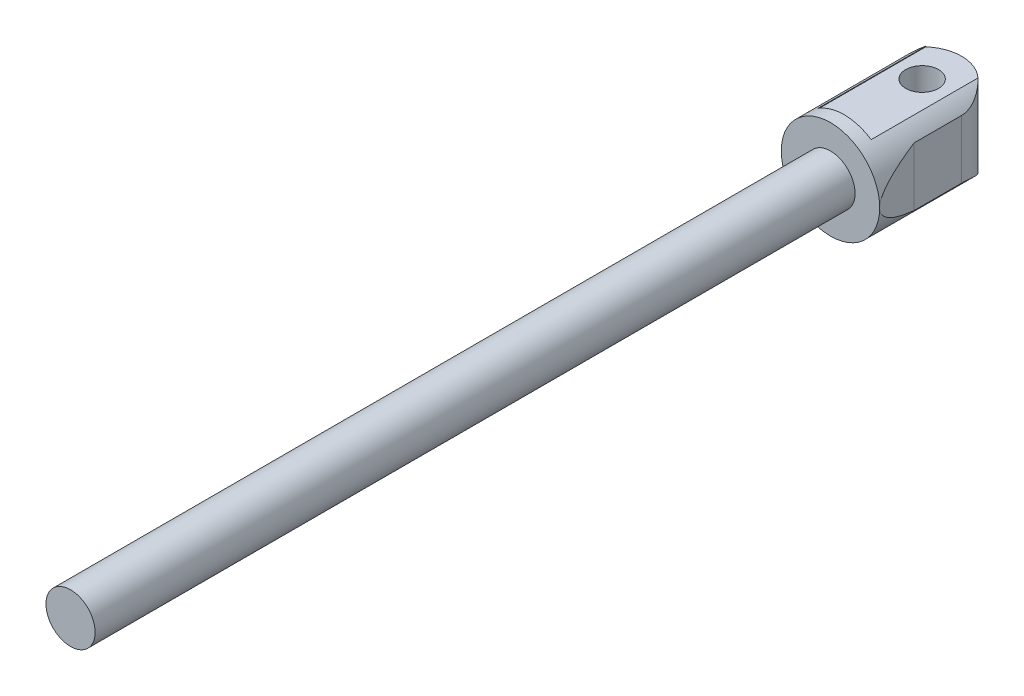
ISO-10303-21;
HEADER;
FILE_DESCRIPTION(('STEP AP214'),'2;1');
FILE_NAME('part.step','',(''),(''),'','','');
FILE_SCHEMA(('AUTOMOTIVE_DESIGN { 1 0 10303 214 1 1 1 1 }'));
ENDSEC;
DATA;
#1=APPLICATION_CONTEXT('core data for automotive mechanical design processes');
#2=APPLICATION_PROTOCOL_DEFINITION('international standard','automotive_design',2000,#1);
#3=PRODUCT_CONTEXT('',#1,'mechanical');
#4=PRODUCT('Part','Part','',(#3));
#5=PRODUCT_RELATED_PRODUCT_CATEGORY('part','',(#4));
#6=PRODUCT_DEFINITION_FORMATION('','',#4);
#7=PRODUCT_DEFINITION_CONTEXT('part definition',#1,'design');
#8=PRODUCT_DEFINITION('design','',#6,#7);
#9=PRODUCT_DEFINITION_SHAPE('','',#8);
#10=(LENGTH_UNIT() NAMED_UNIT(*) SI_UNIT(.MILLI.,.METRE.));
#11=(NAMED_UNIT(*) PLANE_ANGLE_UNIT() SI_UNIT($,.RADIAN.));
#12=(NAMED_UNIT(*) SI_UNIT($,.STERADIAN.) SOLID_ANGLE_UNIT());
#13=UNCERTAINTY_MEASURE_WITH_UNIT(LENGTH_MEASURE(1.E-05),#10,'distance_accuracy_value','');
#14=(GEOMETRIC_REPRESENTATION_CONTEXT(3) GLOBAL_UNCERTAINTY_ASSIGNED_CONTEXT((#13)) GLOBAL_UNIT_ASSIGNED_CONTEXT((#10,
#11,#12)) REPRESENTATION_CONTEXT('',''));
#15=CARTESIAN_POINT('',(0.,0.,0.));
#16=DIRECTION('',(0.,0.,1.));
#17=DIRECTION('',(1.,0.,0.));
#18=AXIS2_PLACEMENT_3D('',#15,#16,#17);
#19=CARTESIAN_POINT('',(0.,0.,-779.5));
#20=DIRECTION('',(0.,0.,1.));
#21=DIRECTION('',(1.,0.,0.));
#22=AXIS2_PLACEMENT_3D('',#19,#20,#21);
#23=CYLINDRICAL_SURFACE('',#22,75.);
#24=CARTESIAN_POINT('',(0.,0.,-600.36));
#25=DIRECTION('',(0.,0.,1.));
#26=DIRECTION('',(1.,0.,0.));
#27=AXIS2_PLACEMENT_3D('',#24,#25,#26);
#28=CIRCLE('',#27,75.);
#29=CARTESIAN_POINT('',(-39.76,-63.5935720022079,-600.36));
#30=VERTEX_POINT('',#29);
#31=CARTESIAN_POINT('',(41.2003774254557,-62.67,-600.36));
#32=VERTEX_POINT('',#31);
#33=EDGE_CURVE('E11',#30,#32,#28,.T.);
#34=ORIENTED_EDGE('',*,*,#33,.T.);
#35=DIRECTION('',(0.,0.,1.));
#36=VECTOR('',#35,1.);
#37=CARTESIAN_POINT('',(41.2003774254557,-62.67,-779.5));
#38=LINE('',#37,#36);
#39=CARTESIAN_POINT('',(41.2003774254557,-62.67,-763.207542593415));
#40=VERTEX_POINT('',#39);
#41=EDGE_CURVE('E164',#32,#40,#38,.F.);
#42=ORIENTED_EDGE('',*,*,#41,.T.);
#43=CARTESIAN_POINT('',(-60.24,-44.6782094538266,-719.26));
#44=CARTESIAN_POINT('',(-60.2400178079099,-44.6781600574085,-719.828290465722));
#45=CARTESIAN_POINT('',(-60.2319587873705,-44.6890508755152,-720.39656218921));
#46=CARTESIAN_POINT('',(-60.1998215340953,-44.7323463897226,-721.531764195724));
#47=CARTESIAN_POINT('',(-60.1757452688689,-44.7647484434477,-722.098694634928));
#48=CARTESIAN_POINT('',(-60.1117618498983,-44.8506276460675,-723.229097348567));
#49=CARTESIAN_POINT('',(-60.0718814338146,-44.9040691990779,-723.792573839809));
#50=CARTESIAN_POINT('',(-59.9765508624123,-45.0313181814211,-724.915865845747));
#51=CARTESIAN_POINT('',(-59.9211003342414,-45.1051260984596,-725.475681272444));
#52=CARTESIAN_POINT('',(-59.7335468937856,-45.3535736231613,-727.133059782846));
#53=CARTESIAN_POINT('',(-59.579345714394,-45.5564629679155,-728.224071832143));
#54=CARTESIAN_POINT('',(-59.2145267124963,-46.0296488247377,-730.381900273667));
#55=CARTESIAN_POINT('',(-59.0038806906372,-46.2999790250019,-731.448704282016));
#56=CARTESIAN_POINT('',(-58.4440093757804,-47.0060329056827,-733.933433028063));
#57=CARTESIAN_POINT('',(-58.0722004683523,-47.4662518580863,-735.339338651747));
#58=CARTESIAN_POINT('',(-57.2382713941835,-48.4685962338971,-738.093774649917));
#59=CARTESIAN_POINT('',(-56.7761192768603,-49.0107506189746,-739.442284519888));
#60=CARTESIAN_POINT('',(-55.7643630895057,-50.1590021187968,-742.090159337451));
#61=CARTESIAN_POINT('',(-55.2141670641873,-50.7655219627618,-743.389112144909));
#62=CARTESIAN_POINT('',(-54.0333462567749,-52.0205706439733,-745.928636163568));
#63=CARTESIAN_POINT('',(-53.4027216703069,-52.6690993790398,-747.16920751676));
#64=CARTESIAN_POINT('',(-52.2762635543612,-53.7829569582085,-749.209025319231));
#65=CARTESIAN_POINT('',(-51.8009972366958,-54.2412545453589,-750.023605457012));
#66=CARTESIAN_POINT('',(-50.8149920012892,-55.166052124261,-751.626333183248));
#67=CARTESIAN_POINT('',(-50.3042507351771,-55.6325526575019,-752.414479016673));
#68=CARTESIAN_POINT('',(-49.2476512471584,-56.5700266881361,-753.964560261676));
#69=CARTESIAN_POINT('',(-48.7017817012025,-57.0410015857711,-754.726487098517));
#70=CARTESIAN_POINT('',(-47.575401564295,-57.9837956644955,-756.223716425041));
#71=CARTESIAN_POINT('',(-46.9948917675563,-58.4556148259876,-756.959019524519));
#72=CARTESIAN_POINT('',(-45.8005633203702,-59.3960016966706,-758.401294882978));
#73=CARTESIAN_POINT('',(-45.1868095734377,-59.8645738605939,-759.108317971517));
#74=CARTESIAN_POINT('',(-43.9251392828326,-60.7963583877545,-760.49491686182));
#75=CARTESIAN_POINT('',(-43.2772221648622,-61.2595706607306,-761.174492201837));
#76=CARTESIAN_POINT('',(-41.9475850550493,-62.1775883903148,-762.505138108048));
#77=CARTESIAN_POINT('',(-41.2658769162934,-62.6323967190465,-763.156218520785));
#78=CARTESIAN_POINT('',(-39.8686242864576,-63.5309605389146,-764.42905593896));
#79=CARTESIAN_POINT('',(-39.1530782386654,-63.9747155201054,-765.050811592679));
#80=CARTESIAN_POINT('',(-37.2468461051281,-65.1117483231765,-766.629320906306));
#81=CARTESIAN_POINT('',(-36.0296742533632,-65.7942495191978,-767.562168566609));
#82=CARTESIAN_POINT('',(-33.5105744588536,-67.1123109247441,-769.342709382505));
#83=CARTESIAN_POINT('',(-32.2086502504295,-67.7478731998406,-770.190406285794));
#84=CARTESIAN_POINT('',(-29.5242213010121,-68.9600364948678,-771.792065043538));
#85=CARTESIAN_POINT('',(-28.1418050675466,-69.5367004253844,-772.5461271012));
#86=CARTESIAN_POINT('',(-25.2999860534751,-70.6202650176077,-773.952599332274));
#87=CARTESIAN_POINT('',(-23.8405962195933,-71.1271773598839,-774.605026527838));
#88=CARTESIAN_POINT('',(-21.0954994923436,-71.9840102433112,-775.701583497893));
#89=CARTESIAN_POINT('',(-19.8201988986271,-72.3460538606143,-776.162332232936));
#90=CARTESIAN_POINT('',(-17.2265455791747,-73.0070978896685,-777.000457002701));
#91=CARTESIAN_POINT('',(-15.9081972883068,-73.3061047720846,-777.377841594868));
#92=CARTESIAN_POINT('',(-13.2362654567833,-73.8353247837602,-778.043957757132));
#93=CARTESIAN_POINT('',(-11.8826965347954,-74.0655659749473,-778.332725491354));
#94=CARTESIAN_POINT('',(-9.14860208476662,-74.4527308048549,-778.817434579232));
#95=CARTESIAN_POINT('',(-7.76807623605475,-74.6096535708486,-779.013374827941));
#96=CARTESIAN_POINT('',(-4.98519133448533,-74.8472104068613,-779.309732770816));
#97=CARTESIAN_POINT('',(-3.58277168330377,-74.9275685164805,-779.409804936656));
#98=CARTESIAN_POINT('',(-0.772047765146182,-75.009203316087,-779.511465603033));
#99=CARTESIAN_POINT('',(0.636256513318128,-75.010479851615,-779.513053911214));
#100=CARTESIAN_POINT('',(3.44738130554763,-74.9339228526574,-779.417719287318));
#101=CARTESIAN_POINT('',(4.85020167031448,-74.8560871834791,-779.320793697029));
#102=CARTESIAN_POINT('',(7.63920987736585,-74.6230571785201,-779.030107990285));
#103=CARTESIAN_POINT('',(9.02539811882413,-74.4678647031341,-778.836350202599));
#104=CARTESIAN_POINT('',(11.6942336026653,-74.0942528678015,-778.368666765328));
#105=CARTESIAN_POINT('',(12.9783419864204,-73.8798453406996,-778.099818481114));
#106=CARTESIAN_POINT('',(15.5150169190735,-73.389053270928,-777.482382498886));
#107=CARTESIAN_POINT('',(16.7675849086185,-73.1126715647391,-777.133798450266));
#108=CARTESIAN_POINT('',(19.2350118305412,-72.5026196247788,-776.361170252726));
#109=CARTESIAN_POINT('',(20.4498655744626,-72.1689415494617,-775.937115774681));
#110=CARTESIAN_POINT('',(22.8366069616576,-71.4495854427753,-775.018250971808));
#111=CARTESIAN_POINT('',(24.0084920516861,-71.0639043276761,-774.523436450872));
#112=CARTESIAN_POINT('',(26.4148763715552,-70.2071026582862,-773.417442933846));
#113=CARTESIAN_POINT('',(27.6446885155894,-69.7313416984657,-772.799666840782));
#114=CARTESIAN_POINT('',(30.044205201299,-68.7316192035965,-771.490943168662));
#115=CARTESIAN_POINT('',(31.2139065790632,-68.2076551354341,-770.799991743892));
#116=CARTESIAN_POINT('',(33.4910847100174,-67.1188541024937,-769.350193254196));
#117=CARTESIAN_POINT('',(34.598538696432,-66.5540023537789,-768.591321607373));
#118=CARTESIAN_POINT('',(36.7492028355753,-65.3910611321772,-767.01075798669));
#119=CARTESIAN_POINT('',(37.7924098854835,-64.7929700566392,-766.189062983052));
#120=CARTESIAN_POINT('',(40.0223723413489,-63.4447737423033,-764.311177013693));
#121=CARTESIAN_POINT('',(41.1943084911169,-62.6887740221905,-763.241593271249));
#122=CARTESIAN_POINT('',(43.4425647326047,-61.1522518580056,-761.022386640751));
#123=CARTESIAN_POINT('',(44.5188691548117,-60.3717254234238,-759.872750690773));
#124=CARTESIAN_POINT('',(46.5763273607766,-58.7990141624916,-757.495810334168));
#125=CARTESIAN_POINT('',(47.557366549967,-58.0068165838935,-756.268415251896));
#126=CARTESIAN_POINT('',(49.421798651803,-56.426751555674,-753.739149518499));
#127=CARTESIAN_POINT('',(50.3052028454613,-55.6388836158117,-752.43728749792));
#128=CARTESIAN_POINT('',(51.89964924515,-54.1526375740352,-749.876267517932));
#129=CARTESIAN_POINT('',(52.6190088208818,-53.4524592129906,-748.623332632824));
#130=CARTESIAN_POINT('',(53.9725150401032,-52.0854346493448,-746.054279861048));
#131=CARTESIAN_POINT('',(54.6066504433973,-51.4185928507644,-744.738153671103));
#132=CARTESIAN_POINT('',(55.7846304354103,-50.1381159757584,-742.043585935046));
#133=CARTESIAN_POINT('',(56.3286040840631,-49.5244054579738,-740.665237118297));
#134=CARTESIAN_POINT('',(57.3211394120789,-48.3721511900354,-737.844339090309));
#135=CARTESIAN_POINT('',(57.7697490469584,-47.8335697069594,-736.401822590383));
#136=CARTESIAN_POINT('',(58.4457191064089,-47.0031279088765,-733.892388728201));
#137=CARTESIAN_POINT('',(58.6992315679535,-46.6854790108299,-732.841028847432));
#138=CARTESIAN_POINT('',(59.1518217809699,-46.1106913011534,-730.710144208112));
#139=CARTESIAN_POINT('',(59.3508975267681,-45.8535547190958,-729.630618413417));
#140=CARTESIAN_POINT('',(59.6906365014732,-45.4104204996476,-727.451267133762));
#141=CARTESIAN_POINT('',(59.8314814126076,-45.2242017418218,-726.351516142372));
#142=CARTESIAN_POINT('',(59.9973427584587,-45.003632668456,-724.690155341706));
#143=CARTESIAN_POINT('',(60.0450574966451,-44.9399092841435,-724.134518285798));
#144=CARTESIAN_POINT('',(60.1251211694355,-44.8327377713292,-723.020211554776));
#145=CARTESIAN_POINT('',(60.1574721518942,-44.7892869406862,-722.461542293874));
#146=CARTESIAN_POINT('',(60.2013344133764,-44.7303073056669,-721.462392425623));
#147=CARTESIAN_POINT('',(60.215827661604,-44.7107879707551,-721.022270619038));
#148=CARTESIAN_POINT('',(60.2351632145741,-44.6847309155557,-720.141438317674));
#149=CARTESIAN_POINT('',(60.2400056620304,-44.6781930033018,-719.700727831697));
#150=CARTESIAN_POINT('',(60.24,-44.6782094538266,-719.26));
#151=B_SPLINE_CURVE_WITH_KNOTS('',3,(#43,#44,#45,#46,#47,#48,#49,#50,#51,#52,#53,#54,#55,#56,
#57,#58,#59,#60,#61,#62,#63,#64,#65,#66,#67,#68,#69,#70,#71,#72,#73,#74,#75,#76,#77,#78,#79,#80,
#81,#82,#83,#84,#85,#86,#87,#88,#89,#90,#91,#92,#93,#94,#95,#96,#97,#98,#99,#100,#101,#102,#103,
#104,#105,#106,#107,#108,#109,#110,#111,#112,#113,#114,#115,#116,#117,#118,#119,#120,#121,#122,
#123,#124,#125,#126,#127,#128,#129,#130,#131,#132,#133,#134,#135,#136,#137,#138,#139,#140,#141,
#142,#143,#144,#145,#146,#147,#148,#149,#150),.UNSPECIFIED.,.F.,.F.,(4,2,2,2,2,2,2,2,2,2,2,2,2,
2,2,2,2,2,2,2,2,2,2,2,2,2,2,2,2,2,2,2,2,2,2,2,2,2,2,2,2,2,2,2,2,2,2,2,2,2,2,2,2,4),(0.,
1.70467825600655,3.40914715318528,5.1107446356174,6.81238286911238,10.1690547530893,
13.5274067378926,18.0960912168657,22.6663943795239,27.2688272269156,31.8712488800422,
35.0160037136267,38.1609669224912,41.3069490787516,44.4528591333346,47.5928343934739,
50.7328624544908,53.8717967571155,57.0108756070996,62.0415609635563,67.0720248100224,
72.0970580485064,77.1212487704394,81.3274604550505,85.5332401653048,89.7373012270587,
93.9414123294897,98.1606195330323,102.379834977388,106.599164272287,110.818392099197,
114.802157722078,118.785741050177,122.769870004199,126.754235317196,131.118584336059,
135.483162836274,139.849327415778,144.215702695104,149.483389309644,154.751937463041,
160.026746623712,165.30094568003,170.113871800534,174.927432075062,179.734041445779,
184.538227978227,187.916895025078,191.295686539215,194.663855068665,196.347306267145,
198.030533013225,199.352627904336,200.674703244482),.UNSPECIFIED.);
#152=CARTESIAN_POINT('',(60.24,-44.6782094538266,-719.26));
#153=VERTEX_POINT('',#152);
#154=EDGE_CURVE('E214',#40,#153,#151,.T.);
#155=ORIENTED_EDGE('',*,*,#154,.T.);
#156=DIRECTION('',(0.,0.,1.));
#157=VECTOR('',#156,1.);
#158=CARTESIAN_POINT('',(60.24,-44.6782094538266,-779.5));
#159=LINE('',#158,#157);
#160=CARTESIAN_POINT('',(60.24,-44.6782094538266,-646.55));
#161=VERTEX_POINT('',#160);
#162=EDGE_CURVE('E300',#153,#161,#159,.T.);
#163=ORIENTED_EDGE('',*,*,#162,.T.);
#164=CARTESIAN_POINT('',(0.,0.,-920.201219512196));
#165=DIRECTION('',(-0.976616950407174,0.,0.214986818613122));
#166=DIRECTION('',(0.214986818613122,0.,0.976616950407174));
#167=AXIS2_PLACEMENT_3D('',#164,#165,#166);
#168=ELLIPSE('',#167,348.85859739599,75.);
#169=CARTESIAN_POINT('',(75.,0.,-579.5));
#170=VERTEX_POINT('',#169);
#171=EDGE_CURVE('E183',#161,#170,#168,.T.);
#172=ORIENTED_EDGE('',*,*,#171,.T.);
#173=CARTESIAN_POINT('',(0.,0.,-579.5));
#174=DIRECTION('',(0.,0.,-1.));
#175=DIRECTION('',(-1.,0.,0.));
#176=AXIS2_PLACEMENT_3D('',#173,#174,#175);
#177=CIRCLE('',#176,75.);
#178=CARTESIAN_POINT('',(-75.,0.,-579.5));
#179=VERTEX_POINT('',#178);
#180=EDGE_CURVE('E270',#170,#179,#177,.T.);
#181=ORIENTED_EDGE('',*,*,#180,.T.);
#182=CARTESIAN_POINT('',(0.,0.,-920.201219512196));
#183=DIRECTION('',(0.976616950407174,0.,0.214986818613122));
#184=DIRECTION('',(-0.214986818613122,0.,0.976616950407174));
#185=AXIS2_PLACEMENT_3D('',#182,#183,#184);
#186=ELLIPSE('',#185,348.85859739599,75.);
#187=CARTESIAN_POINT('',(-60.24,-44.6782094538266,-646.55));
#188=VERTEX_POINT('',#187);
#189=EDGE_CURVE('E203',#179,#188,#186,.T.);
#190=ORIENTED_EDGE('',*,*,#189,.T.);
#191=DIRECTION('',(0.,0.,1.));
#192=VECTOR('',#191,1.);
#193=CARTESIAN_POINT('',(-60.24,-44.6782094538266,-779.5));
#194=LINE('',#193,#192);
#195=CARTESIAN_POINT('',(-60.24,-44.6782094538266,-719.26));
#196=VERTEX_POINT('',#195);
#197=EDGE_CURVE('E297',#188,#196,#194,.F.);
#198=ORIENTED_EDGE('',*,*,#197,.T.);
#199=CARTESIAN_POINT('',(-39.76,-63.5935720022079,-764.514833995939));
#200=VERTEX_POINT('',#199);
#201=EDGE_CURVE('E216',#196,#200,#151,.T.);
#202=ORIENTED_EDGE('',*,*,#201,.T.);
#203=DIRECTION('',(0.,0.,1.));
#204=VECTOR('',#203,1.);
#205=CARTESIAN_POINT('',(-39.76,-63.5935720022079,-779.5));
#206=LINE('',#205,#204);
#207=EDGE_CURVE('E67',#30,#200,#206,.F.);
#208=ORIENTED_EDGE('',*,*,#207,.F.);
#209=EDGE_LOOP('',(#34,#42,#155,#163,#172,#181,#190,#198,#202,#208));
#210=FACE_BOUND('',#209,.T.);
#211=ADVANCED_FACE('F43',(#210),#23,.T.);
#212=CARTESIAN_POINT('',(0.,0.,579.5));
#213=DIRECTION('',(0.,0.,-1.));
#214=DIRECTION('',(-1.,0.,0.));
#215=AXIS2_PLACEMENT_3D('',#212,#213,#214);
#216=CYLINDRICAL_SURFACE('',#215,37.5);
#217=CARTESIAN_POINT('',(0.,0.,579.5));
#218=DIRECTION('',(0.,0.,1.));
#219=DIRECTION('',(1.,0.,0.));
#220=AXIS2_PLACEMENT_3D('',#217,#218,#219);
#221=CIRCLE('',#220,37.5);
#222=CARTESIAN_POINT('',(37.5,0.,579.5));
#223=VERTEX_POINT('',#222);
#224=EDGE_CURVE('E282',#223,#223,#221,.T.);
#225=ORIENTED_EDGE('',*,*,#224,.F.);
#226=EDGE_LOOP('',(#225));
#227=FACE_BOUND('',#226,.T.);
#228=CARTESIAN_POINT('',(0.,0.,-579.5));
#229=DIRECTION('',(0.,0.,1.));
#230=DIRECTION('',(1.,0.,0.));
#231=AXIS2_PLACEMENT_3D('',#228,#229,#230);
#232=CIRCLE('',#231,37.5);
#233=CARTESIAN_POINT('',(37.5,0.,-579.5));
#234=VERTEX_POINT('',#233);
#235=EDGE_CURVE('E280',#234,#234,#232,.T.);
#236=ORIENTED_EDGE('',*,*,#235,.T.);
#237=EDGE_LOOP('',(#236));
#238=FACE_BOUND('',#237,.T.);
#239=ADVANCED_FACE('F45',(#227,#238),#216,.T.);
#240=CARTESIAN_POINT('',(0.,0.,579.5));
#241=DIRECTION('',(0.,0.,1.));
#242=DIRECTION('',(1.,0.,0.));
#243=AXIS2_PLACEMENT_3D('',#240,#241,#242);
#244=PLANE('',#243);
#245=ORIENTED_EDGE('',*,*,#224,.T.);
#246=EDGE_LOOP('',(#245));
#247=FACE_BOUND('',#246,.T.);
#248=ADVANCED_FACE('F244',(#247),#244,.T.);
#249=CARTESIAN_POINT('',(60.24,44.6782094538266,-719.26));
#250=CARTESIAN_POINT('',(60.2400178079099,44.6781600574085,-719.828290465722));
#251=CARTESIAN_POINT('',(60.2319587873705,44.6890508755152,-720.39656218921));
#252=CARTESIAN_POINT('',(60.1998215340953,44.7323463897226,-721.531764195724));
#253=CARTESIAN_POINT('',(60.1757452688689,44.7647484434477,-722.098694634928));
#254=CARTESIAN_POINT('',(60.1117618498983,44.8506276460675,-723.229097348567));
#255=CARTESIAN_POINT('',(60.0718814338146,44.9040691990779,-723.792573839809));
#256=CARTESIAN_POINT('',(59.9765508624123,45.0313181814211,-724.915865845747));
#257=CARTESIAN_POINT('',(59.9211003342414,45.1051260984596,-725.475681272444));
#258=CARTESIAN_POINT('',(59.7335468937856,45.3535736231613,-727.133059782846));
#259=CARTESIAN_POINT('',(59.579345714394,45.5564629679155,-728.224071832143));
#260=CARTESIAN_POINT('',(59.2145267124963,46.0296488247377,-730.381900273667));
#261=CARTESIAN_POINT('',(59.0038806906372,46.2999790250019,-731.448704282016));
#262=CARTESIAN_POINT('',(58.4440093757804,47.0060329056827,-733.933433028063));
#263=CARTESIAN_POINT('',(58.0722004683523,47.4662518580863,-735.339338651747));
#264=CARTESIAN_POINT('',(57.2382713941835,48.4685962338971,-738.093774649917));
#265=CARTESIAN_POINT('',(56.7761192768603,49.0107506189746,-739.442284519888));
#266=CARTESIAN_POINT('',(55.7643630895057,50.1590021187968,-742.090159337451));
#267=CARTESIAN_POINT('',(55.2141670641873,50.7655219627618,-743.389112144909));
#268=CARTESIAN_POINT('',(54.0333462567749,52.0205706439733,-745.928636163568));
#269=CARTESIAN_POINT('',(53.4027216703069,52.6690993790398,-747.16920751676));
#270=CARTESIAN_POINT('',(52.2762635543612,53.7829569582085,-749.209025319231));
#271=CARTESIAN_POINT('',(51.8009972366958,54.2412545453589,-750.023605457012));
#272=CARTESIAN_POINT('',(50.8149920012892,55.166052124261,-751.626333183248));
#273=CARTESIAN_POINT('',(50.3042507351771,55.6325526575019,-752.414479016673));
#274=CARTESIAN_POINT('',(49.2476512471584,56.5700266881361,-753.964560261676));
#275=CARTESIAN_POINT('',(48.7017817012025,57.0410015857711,-754.726487098517));
#276=CARTESIAN_POINT('',(47.575401564295,57.9837956644955,-756.223716425041));
#277=CARTESIAN_POINT('',(46.9948917675563,58.4556148259876,-756.959019524519));
#278=CARTESIAN_POINT('',(45.8005633203702,59.3960016966706,-758.401294882978));
#279=CARTESIAN_POINT('',(45.1868095734377,59.8645738605939,-759.108317971517));
#280=CARTESIAN_POINT('',(43.9251392828326,60.7963583877545,-760.49491686182));
#281=CARTESIAN_POINT('',(43.2772221648622,61.2595706607306,-761.174492201837));
#282=CARTESIAN_POINT('',(41.9475850550493,62.1775883903148,-762.505138108048));
#283=CARTESIAN_POINT('',(41.2658769162934,62.6323967190465,-763.156218520785));
#284=CARTESIAN_POINT('',(39.8686242864576,63.5309605389146,-764.42905593896));
#285=CARTESIAN_POINT('',(39.1530782386654,63.9747155201054,-765.050811592679));
#286=CARTESIAN_POINT('',(37.2468461051281,65.1117483231765,-766.629320906306));
#287=CARTESIAN_POINT('',(36.0296742533632,65.7942495191978,-767.562168566609));
#288=CARTESIAN_POINT('',(33.5105744588536,67.1123109247441,-769.342709382505));
#289=CARTESIAN_POINT('',(32.2086502504295,67.7478731998406,-770.190406285794));
#290=CARTESIAN_POINT('',(29.5242213010121,68.9600364948678,-771.792065043538));
#291=CARTESIAN_POINT('',(28.1418050675466,69.5367004253844,-772.5461271012));
#292=CARTESIAN_POINT('',(25.2999860534751,70.6202650176077,-773.952599332274));
#293=CARTESIAN_POINT('',(23.8405962195933,71.1271773598839,-774.605026527838));
#294=CARTESIAN_POINT('',(21.0954994923436,71.9840102433112,-775.701583497893));
#295=CARTESIAN_POINT('',(19.8201988986271,72.3460538606143,-776.162332232936));
#296=CARTESIAN_POINT('',(17.2265455791747,73.0070978896685,-777.000457002701));
#297=CARTESIAN_POINT('',(15.9081972883068,73.3061047720846,-777.377841594868));
#298=CARTESIAN_POINT('',(13.2362654567833,73.8353247837602,-778.043957757132));
#299=CARTESIAN_POINT('',(11.8826965347954,74.0655659749473,-778.332725491354));
#300=CARTESIAN_POINT('',(9.14860208476662,74.4527308048549,-778.817434579232));
#301=CARTESIAN_POINT('',(7.76807623605475,74.6096535708486,-779.013374827941));
#302=CARTESIAN_POINT('',(4.98519133448533,74.8472104068613,-779.309732770816));
#303=CARTESIAN_POINT('',(3.58277168330377,74.9275685164805,-779.409804936656));
#304=CARTESIAN_POINT('',(0.772047765146182,75.009203316087,-779.511465603033));
#305=CARTESIAN_POINT('',(-0.636256513318128,75.010479851615,-779.513053911214));
#306=CARTESIAN_POINT('',(-3.44738130554763,74.9339228526574,-779.417719287318));
#307=CARTESIAN_POINT('',(-4.85020167031448,74.8560871834791,-779.320793697029));
#308=CARTESIAN_POINT('',(-7.63920987736585,74.6230571785201,-779.030107990285));
#309=CARTESIAN_POINT('',(-9.02539811882413,74.4678647031341,-778.836350202599));
#310=CARTESIAN_POINT('',(-11.6942336026653,74.0942528678015,-778.368666765328));
#311=CARTESIAN_POINT('',(-12.9783419864204,73.8798453406996,-778.099818481114));
#312=CARTESIAN_POINT('',(-15.5150169190735,73.389053270928,-777.482382498886));
#313=CARTESIAN_POINT('',(-16.7675849086185,73.1126715647391,-777.133798450266));
#314=CARTESIAN_POINT('',(-19.2350118305412,72.5026196247788,-776.361170252726));
#315=CARTESIAN_POINT('',(-20.4498655744626,72.1689415494617,-775.937115774681));
#316=CARTESIAN_POINT('',(-22.8366069616576,71.4495854427753,-775.018250971808));
#317=CARTESIAN_POINT('',(-24.0084920516861,71.0639043276761,-774.523436450872));
#318=CARTESIAN_POINT('',(-26.4148763715552,70.2071026582862,-773.417442933846));
#319=CARTESIAN_POINT('',(-27.6446885155894,69.7313416984657,-772.799666840782));
#320=CARTESIAN_POINT('',(-30.044205201299,68.7316192035965,-771.490943168662));
#321=CARTESIAN_POINT('',(-31.2139065790632,68.2076551354341,-770.799991743892));
#322=CARTESIAN_POINT('',(-33.4910847100174,67.1188541024937,-769.350193254196));
#323=CARTESIAN_POINT('',(-34.598538696432,66.5540023537789,-768.591321607373));
#324=CARTESIAN_POINT('',(-36.7492028355753,65.3910611321772,-767.01075798669));
#325=CARTESIAN_POINT('',(-37.7924098854835,64.7929700566392,-766.189062983052));
#326=CARTESIAN_POINT('',(-40.0223723413489,63.4447737423033,-764.311177013693));
#327=CARTESIAN_POINT('',(-41.1943084911169,62.6887740221905,-763.241593271249));
#328=CARTESIAN_POINT('',(-43.4425647326047,61.1522518580056,-761.022386640751));
#329=CARTESIAN_POINT('',(-44.5188691548117,60.3717254234238,-759.872750690773));
#330=CARTESIAN_POINT('',(-46.5763273607766,58.7990141624916,-757.495810334168));
#331=CARTESIAN_POINT('',(-47.557366549967,58.0068165838935,-756.268415251896));
#332=CARTESIAN_POINT('',(-49.421798651803,56.426751555674,-753.739149518499));
#333=CARTESIAN_POINT('',(-50.3052028454613,55.6388836158117,-752.43728749792));
#334=CARTESIAN_POINT('',(-51.89964924515,54.1526375740352,-749.876267517932));
#335=CARTESIAN_POINT('',(-52.6190088208818,53.4524592129906,-748.623332632824));
#336=CARTESIAN_POINT('',(-53.9725150401032,52.0854346493448,-746.054279861048));
#337=CARTESIAN_POINT('',(-54.6066504433973,51.4185928507644,-744.738153671103));
#338=CARTESIAN_POINT('',(-55.7846304354103,50.1381159757584,-742.043585935046));
#339=CARTESIAN_POINT('',(-56.3286040840631,49.5244054579738,-740.665237118297));
#340=CARTESIAN_POINT('',(-57.3211394120789,48.3721511900354,-737.844339090309));
#341=CARTESIAN_POINT('',(-57.7697490469584,47.8335697069594,-736.401822590383));
#342=CARTESIAN_POINT('',(-58.4457191064089,47.0031279088765,-733.892388728201));
#343=CARTESIAN_POINT('',(-58.6992315679535,46.6854790108299,-732.841028847432));
#344=CARTESIAN_POINT('',(-59.1518217809699,46.1106913011534,-730.710144208112));
#345=CARTESIAN_POINT('',(-59.3508975267681,45.8535547190958,-729.630618413417));
#346=CARTESIAN_POINT('',(-59.6906365014732,45.4104204996476,-727.451267133762));
#347=CARTESIAN_POINT('',(-59.8314814126076,45.2242017418218,-726.351516142372));
#348=CARTESIAN_POINT('',(-59.9973427584587,45.003632668456,-724.690155341706));
#349=CARTESIAN_POINT('',(-60.0450574966451,44.9399092841435,-724.134518285798));
#350=CARTESIAN_POINT('',(-60.1251211694355,44.8327377713292,-723.020211554776));
#351=CARTESIAN_POINT('',(-60.1574721518942,44.7892869406862,-722.461542293874));
#352=CARTESIAN_POINT('',(-60.2013344133764,44.7303073056669,-721.462392425623));
#353=CARTESIAN_POINT('',(-60.215827661604,44.7107879707551,-721.022270619038));
#354=CARTESIAN_POINT('',(-60.2351632145741,44.6847309155557,-720.141438317674));
#355=CARTESIAN_POINT('',(-60.2400056620304,44.6781930033018,-719.700727831697));
#356=CARTESIAN_POINT('',(-60.24,44.6782094538266,-719.26));
#357=B_SPLINE_CURVE_WITH_KNOTS('',3,(#249,#250,#251,#252,#253,#254,#255,#256,#257,#258,#259,
#260,#261,#262,#263,#264,#265,#266,#267,#268,#269,#270,#271,#272,#273,#274,#275,#276,#277,#278,
#279,#280,#281,#282,#283,#284,#285,#286,#287,#288,#289,#290,#291,#292,#293,#294,#295,#296,#297,
#298,#299,#300,#301,#302,#303,#304,#305,#306,#307,#308,#309,#310,#311,#312,#313,#314,#315,#316,
#317,#318,#319,#320,#321,#322,#323,#324,#325,#326,#327,#328,#329,#330,#331,#332,#333,#334,#335,
#336,#337,#338,#339,#340,#341,#342,#343,#344,#345,#346,#347,#348,#349,#350,#351,#352,#353,#354,
#355,#356),.UNSPECIFIED.,.F.,.F.,(4,2,2,2,2,2,2,2,2,2,2,2,2,2,2,2,2,2,2,2,2,2,2,2,2,2,2,2,2,2,2,
2,2,2,2,2,2,2,2,2,2,2,2,2,2,2,2,2,2,2,2,2,2,4),(0.,1.70467825600655,3.40914715318528,
5.1107446356174,6.81238286911238,10.1690547530893,13.5274067378926,18.0960912168657,
22.6663943795239,27.2688272269156,31.8712488800422,35.0160037136267,38.1609669224912,
41.3069490787516,44.4528591333346,47.5928343934739,50.7328624544908,53.8717967571155,
57.0108756070996,62.0415609635563,67.0720248100224,72.0970580485064,77.1212487704394,
81.3274604550505,85.5332401653048,89.7373012270587,93.9414123294897,98.1606195330323,
102.379834977388,106.599164272287,110.818392099197,114.802157722078,118.785741050177,
122.769870004199,126.754235317196,131.118584336059,135.483162836274,139.849327415778,
144.215702695104,149.483389309644,154.751937463041,160.026746623712,165.30094568003,
170.113871800534,174.927432075062,179.734041445779,184.538227978227,187.916895025078,
191.295686539215,194.663855068665,196.347306267145,198.030533013225,199.352627904336,
200.674703244482),.UNSPECIFIED.);
#358=CARTESIAN_POINT('',(60.24,44.6782094538266,-719.26));
#359=VERTEX_POINT('',#358);
#360=CARTESIAN_POINT('',(41.2003774254557,62.67,-763.207542593415));
#361=VERTEX_POINT('',#360);
#362=EDGE_CURVE('E204',#359,#361,#357,.T.);
#363=ORIENTED_EDGE('',*,*,#362,.T.);
#364=DIRECTION('',(0.,0.,1.));
#365=VECTOR('',#364,1.);
#366=CARTESIAN_POINT('',(41.2003774254557,62.67,-779.5));
#367=LINE('',#366,#365);
#368=CARTESIAN_POINT('',(41.2003774254557,62.67,-600.36));
#369=VERTEX_POINT('',#368);
#370=EDGE_CURVE('E171',#361,#369,#367,.T.);
#371=ORIENTED_EDGE('',*,*,#370,.T.);
#372=CARTESIAN_POINT('',(0.,0.,-600.36));
#373=DIRECTION('',(0.,0.,1.));
#374=DIRECTION('',(1.,0.,0.));
#375=AXIS2_PLACEMENT_3D('',#372,#373,#374);
#376=CIRCLE('',#375,75.);
#377=CARTESIAN_POINT('',(-39.76,63.5935720022079,-600.36));
#378=VERTEX_POINT('',#377);
#379=EDGE_CURVE('E52',#369,#378,#376,.T.);
#380=ORIENTED_EDGE('',*,*,#379,.T.);
#381=DIRECTION('',(0.,0.,1.));
#382=VECTOR('',#381,1.);
#383=CARTESIAN_POINT('',(-39.76,63.5935720022079,-779.5));
#384=LINE('',#383,#382);
#385=CARTESIAN_POINT('',(-39.76,63.5935720022079,-764.514833995939));
#386=VERTEX_POINT('',#385);
#387=EDGE_CURVE('E130',#378,#386,#384,.F.);
#388=ORIENTED_EDGE('',*,*,#387,.T.);
#389=CARTESIAN_POINT('',(-60.24,44.6782094538266,-719.26));
#390=VERTEX_POINT('',#389);
#391=EDGE_CURVE('E215',#386,#390,#357,.T.);
#392=ORIENTED_EDGE('',*,*,#391,.T.);
#393=DIRECTION('',(0.,0.,1.));
#394=VECTOR('',#393,1.);
#395=CARTESIAN_POINT('',(-60.24,44.6782094538266,-779.5));
#396=LINE('',#395,#394);
#397=CARTESIAN_POINT('',(-60.24,44.6782094538266,-646.55));
#398=VERTEX_POINT('',#397);
#399=EDGE_CURVE('E293',#390,#398,#396,.T.);
#400=ORIENTED_EDGE('',*,*,#399,.T.);
#401=EDGE_CURVE('E199',#398,#179,#186,.T.);
#402=ORIENTED_EDGE('',*,*,#401,.T.);
#403=EDGE_CURVE('E274',#179,#170,#177,.T.);
#404=ORIENTED_EDGE('',*,*,#403,.T.);
#405=CARTESIAN_POINT('',(60.24,44.6782094538266,-646.55));
#406=VERTEX_POINT('',#405);
#407=EDGE_CURVE('E198',#170,#406,#168,.T.);
#408=ORIENTED_EDGE('',*,*,#407,.T.);
#409=DIRECTION('',(0.,0.,1.));
#410=VECTOR('',#409,1.);
#411=CARTESIAN_POINT('',(60.24,44.6782094538266,-779.5));
#412=LINE('',#411,#410);
#413=EDGE_CURVE('E286',#406,#359,#412,.F.);
#414=ORIENTED_EDGE('',*,*,#413,.T.);
#415=EDGE_LOOP('',(#363,#371,#380,#388,#392,#400,#402,#404,#408,#414));
#416=FACE_BOUND('',#415,.T.);
#417=ADVANCED_FACE('F222',(#416),#23,.T.);
#418=CARTESIAN_POINT('',(0.,0.,-579.5));
#419=DIRECTION('',(0.,0.,-1.));
#420=DIRECTION('',(-1.,0.,0.));
#421=AXIS2_PLACEMENT_3D('',#418,#419,#420);
#422=PLANE('',#421);
#423=ORIENTED_EDGE('',*,*,#235,.F.);
#424=EDGE_LOOP('',(#423));
#425=FACE_BOUND('',#424,.T.);
#426=ORIENTED_EDGE('',*,*,#403,.F.);
#427=ORIENTED_EDGE('',*,*,#180,.F.);
#428=EDGE_LOOP('',(#426,#427));
#429=FACE_BOUND('',#428,.T.);
#430=ADVANCED_FACE('F237',(#425,#429),#422,.F.);
#431=CARTESIAN_POINT('',(-60.24,-100.,-719.26));
#432=DIRECTION('',(1.,0.,0.));
#433=DIRECTION('',(0.,0.,-1.));
#434=AXIS2_PLACEMENT_3D('',#431,#432,#433);
#435=PLANE('',#434);
#436=DIRECTION('',(0.,1.,0.));
#437=VECTOR('',#436,1.);
#438=CARTESIAN_POINT('',(-60.24,-100.,-719.26));
#439=LINE('',#438,#437);
#440=EDGE_CURVE('E178',#196,#390,#439,.T.);
#441=ORIENTED_EDGE('',*,*,#440,.F.);
#442=ORIENTED_EDGE('',*,*,#197,.F.);
#443=DIRECTION('',(0.,1.,0.));
#444=VECTOR('',#443,1.);
#445=CARTESIAN_POINT('',(-60.24,-100.,-646.55));
#446=LINE('',#445,#444);
#447=EDGE_CURVE('E179',#188,#398,#446,.T.);
#448=ORIENTED_EDGE('',*,*,#447,.T.);
#449=ORIENTED_EDGE('',*,*,#399,.F.);
#450=EDGE_LOOP('',(#441,#442,#448,#449));
#451=FACE_BOUND('',#450,.T.);
#452=ADVANCED_FACE('F234',(#451),#435,.F.);
#453=CARTESIAN_POINT('',(60.24,-100.,-719.26));
#454=DIRECTION('',(-1.,0.,0.));
#455=DIRECTION('',(0.,0.,1.));
#456=AXIS2_PLACEMENT_3D('',#453,#454,#455);
#457=PLANE('',#456);
#458=DIRECTION('',(0.,1.,0.));
#459=VECTOR('',#458,1.);
#460=CARTESIAN_POINT('',(60.24,-100.,-719.26));
#461=LINE('',#460,#459);
#462=EDGE_CURVE('E188',#153,#359,#461,.T.);
#463=ORIENTED_EDGE('',*,*,#462,.T.);
#464=ORIENTED_EDGE('',*,*,#413,.F.);
#465=DIRECTION('',(0.,1.,0.));
#466=VECTOR('',#465,1.);
#467=CARTESIAN_POINT('',(60.24,-100.,-646.55));
#468=LINE('',#467,#466);
#469=EDGE_CURVE('E184',#161,#406,#468,.T.);
#470=ORIENTED_EDGE('',*,*,#469,.F.);
#471=ORIENTED_EDGE('',*,*,#162,.F.);
#472=EDGE_LOOP('',(#463,#464,#470,#471));
#473=FACE_BOUND('',#472,.T.);
#474=ADVANCED_FACE('F231',(#473),#457,.F.);
#475=CARTESIAN_POINT('',(0.,-100.,-719.26));
#476=DIRECTION('',(0.,1.,0.));
#477=DIRECTION('',(0.,0.,1.));
#478=AXIS2_PLACEMENT_3D('',#475,#476,#477);
#479=CYLINDRICAL_SURFACE('',#478,60.24);
#480=DIRECTION('',(0.,1.,0.));
#481=VECTOR('',#480,1.);
#482=CARTESIAN_POINT('',(-39.76,-100.,-764.514833995939));
#483=LINE('',#482,#481);
#484=CARTESIAN_POINT('',(-39.76,62.67,-764.514833995939));
#485=VERTEX_POINT('',#484);
#486=EDGE_CURVE('E311',#386,#485,#483,.F.);
#487=ORIENTED_EDGE('',*,*,#486,.T.);
#488=CARTESIAN_POINT('',(0.,62.67,-719.26));
#489=DIRECTION('',(0.,-1.,0.));
#490=DIRECTION('',(0.,0.,-1.));
#491=AXIS2_PLACEMENT_3D('',#488,#489,#490);
#492=CIRCLE('',#491,60.24);
#493=EDGE_CURVE('E146',#485,#361,#492,.T.);
#494=ORIENTED_EDGE('',*,*,#493,.T.);
#495=ORIENTED_EDGE('',*,*,#362,.F.);
#496=ORIENTED_EDGE('',*,*,#462,.F.);
#497=ORIENTED_EDGE('',*,*,#154,.F.);
#498=CARTESIAN_POINT('',(0.,-62.67,-719.26));
#499=DIRECTION('',(0.,1.,0.));
#500=DIRECTION('',(0.,0.,1.));
#501=AXIS2_PLACEMENT_3D('',#498,#499,#500);
#502=CIRCLE('',#501,60.24);
#503=CARTESIAN_POINT('',(-39.76,-62.67,-764.514833995939));
#504=VERTEX_POINT('',#503);
#505=EDGE_CURVE('E160',#40,#504,#502,.T.);
#506=ORIENTED_EDGE('',*,*,#505,.T.);
#507=DIRECTION('',(0.,1.,0.));
#508=VECTOR('',#507,1.);
#509=CARTESIAN_POINT('',(-39.76,-100.,-764.514833995939));
#510=LINE('',#509,#508);
#511=EDGE_CURVE('E262',#200,#504,#510,.T.);
#512=ORIENTED_EDGE('',*,*,#511,.F.);
#513=ORIENTED_EDGE('',*,*,#201,.F.);
#514=ORIENTED_EDGE('',*,*,#440,.T.);
#515=ORIENTED_EDGE('',*,*,#391,.F.);
#516=EDGE_LOOP('',(#487,#494,#495,#496,#497,#506,#512,#513,#514,#515));
#517=FACE_BOUND('',#516,.T.);
#518=ADVANCED_FACE('F225',(#517),#479,.T.);
#519=CARTESIAN_POINT('',(-60.24,-100.,-646.55));
#520=DIRECTION('',(0.976616950407174,0.,0.214986818613122));
#521=DIRECTION('',(0.214986818613122,0.,-0.976616950407174));
#522=AXIS2_PLACEMENT_3D('',#519,#520,#521);
#523=PLANE('',#522);
#524=ORIENTED_EDGE('',*,*,#401,.F.);
#525=ORIENTED_EDGE('',*,*,#447,.F.);
#526=ORIENTED_EDGE('',*,*,#189,.F.);
#527=EDGE_LOOP('',(#524,#525,#526));
#528=FACE_BOUND('',#527,.T.);
#529=ADVANCED_FACE('F230',(#528),#523,.F.);
#530=CARTESIAN_POINT('',(60.24,-100.,-646.55));
#531=DIRECTION('',(-0.976616950407174,0.,0.214986818613122));
#532=DIRECTION('',(0.214986818613122,0.,0.976616950407174));
#533=AXIS2_PLACEMENT_3D('',#530,#531,#532);
#534=PLANE('',#533);
#535=ORIENTED_EDGE('',*,*,#171,.F.);
#536=ORIENTED_EDGE('',*,*,#469,.T.);
#537=ORIENTED_EDGE('',*,*,#407,.F.);
#538=EDGE_LOOP('',(#535,#536,#537));
#539=FACE_BOUND('',#538,.T.);
#540=ADVANCED_FACE('F324',(#539),#534,.F.);
#541=CARTESIAN_POINT('',(-39.76,-62.67,-600.36));
#542=DIRECTION('',(0.,0.,1.));
#543=DIRECTION('',(1.,0.,0.));
#544=AXIS2_PLACEMENT_3D('',#541,#542,#543);
#545=PLANE('',#544);
#546=DIRECTION('',(0.,-1.,0.));
#547=VECTOR('',#546,1.);
#548=CARTESIAN_POINT('',(-39.76,-62.67,-600.36));
#549=LINE('',#548,#547);
#550=CARTESIAN_POINT('',(-39.76,-62.67,-600.36));
#551=VERTEX_POINT('',#550);
#552=EDGE_CURVE('E134',#551,#30,#549,.T.);
#553=ORIENTED_EDGE('',*,*,#552,.F.);
#554=DIRECTION('',(1.,0.,0.));
#555=VECTOR('',#554,1.);
#556=CARTESIAN_POINT('',(-39.76,-62.67,-600.36));
#557=LINE('',#556,#555);
#558=EDGE_CURVE('E151',#551,#32,#557,.T.);
#559=ORIENTED_EDGE('',*,*,#558,.T.);
#560=ORIENTED_EDGE('',*,*,#33,.F.);
#561=EDGE_LOOP('',(#553,#559,#560));
#562=FACE_BOUND('',#561,.T.);
#563=ADVANCED_FACE('F258',(#562),#545,.F.);
#564=CARTESIAN_POINT('',(-39.7599999999998,0.,0.));
#565=DIRECTION('',(1.,0.,0.));
#566=DIRECTION('',(0.,0.,-1.));
#567=AXIS2_PLACEMENT_3D('',#564,#565,#566);
#568=PLANE('',#567);
#569=ORIENTED_EDGE('',*,*,#207,.T.);
#570=ORIENTED_EDGE('',*,*,#511,.T.);
#571=DIRECTION('',(0.,0.,1.));
#572=VECTOR('',#571,1.);
#573=CARTESIAN_POINT('',(-39.76,-62.67,-600.36));
#574=LINE('',#573,#572);
#575=EDGE_CURVE('E155',#504,#551,#574,.T.);
#576=ORIENTED_EDGE('',*,*,#575,.T.);
#577=ORIENTED_EDGE('',*,*,#552,.T.);
#578=EDGE_LOOP('',(#569,#570,#576,#577));
#579=FACE_BOUND('',#578,.T.);
#580=ADVANCED_FACE('F260',(#579),#568,.T.);
#581=CARTESIAN_POINT('',(-39.76,-62.67,-600.36));
#582=DIRECTION('',(0.,1.,0.));
#583=DIRECTION('',(0.,0.,1.));
#584=AXIS2_PLACEMENT_3D('',#581,#582,#583);
#585=PLANE('',#584);
#586=CARTESIAN_POINT('',(0.,-62.67,-719.26));
#587=DIRECTION('',(0.,1.,0.));
#588=DIRECTION('',(0.,0.,1.));
#589=AXIS2_PLACEMENT_3D('',#586,#587,#588);
#590=CIRCLE('',#589,25.);
#591=CARTESIAN_POINT('',(0.,-62.67,-694.26));
#592=VERTEX_POINT('',#591);
#593=EDGE_CURVE('E142',#592,#592,#590,.F.);
#594=ORIENTED_EDGE('',*,*,#593,.F.);
#595=EDGE_LOOP('',(#594));
#596=FACE_BOUND('',#595,.T.);
#597=ORIENTED_EDGE('',*,*,#558,.F.);
#598=ORIENTED_EDGE('',*,*,#575,.F.);
#599=ORIENTED_EDGE('',*,*,#505,.F.);
#600=ORIENTED_EDGE('',*,*,#41,.F.);
#601=EDGE_LOOP('',(#597,#598,#599,#600));
#602=FACE_BOUND('',#601,.T.);
#603=ADVANCED_FACE('F264',(#596,#602),#585,.F.);
#604=CARTESIAN_POINT('',(-39.76,62.67,-600.36));
#605=DIRECTION('',(0.,0.,1.));
#606=DIRECTION('',(1.,0.,0.));
#607=AXIS2_PLACEMENT_3D('',#604,#605,#606);
#608=PLANE('',#607);
#609=DIRECTION('',(1.,0.,0.));
#610=VECTOR('',#609,1.);
#611=CARTESIAN_POINT('',(-39.76,62.67,-600.36));
#612=LINE('',#611,#610);
#613=CARTESIAN_POINT('',(-39.76,62.67,-600.36));
#614=VERTEX_POINT('',#613);
#615=EDGE_CURVE('E137',#614,#369,#612,.T.);
#616=ORIENTED_EDGE('',*,*,#615,.F.);
#617=DIRECTION('',(0.,-1.,0.));
#618=VECTOR('',#617,1.);
#619=CARTESIAN_POINT('',(-39.76,62.67,-600.36));
#620=LINE('',#619,#618);
#621=EDGE_CURVE('E126',#378,#614,#620,.T.);
#622=ORIENTED_EDGE('',*,*,#621,.F.);
#623=ORIENTED_EDGE('',*,*,#379,.F.);
#624=EDGE_LOOP('',(#616,#622,#623));
#625=FACE_BOUND('',#624,.T.);
#626=ADVANCED_FACE('F138',(#625),#608,.F.);
#627=CARTESIAN_POINT('',(-39.7599999999998,0.,0.));
#628=DIRECTION('',(-1.,0.,0.));
#629=DIRECTION('',(0.,0.,1.));
#630=AXIS2_PLACEMENT_3D('',#627,#628,#629);
#631=PLANE('',#630);
#632=ORIENTED_EDGE('',*,*,#621,.T.);
#633=DIRECTION('',(0.,0.,-1.));
#634=VECTOR('',#633,1.);
#635=CARTESIAN_POINT('',(-39.76,62.67,-600.36));
#636=LINE('',#635,#634);
#637=EDGE_CURVE('E59',#614,#485,#636,.T.);
#638=ORIENTED_EDGE('',*,*,#637,.T.);
#639=ORIENTED_EDGE('',*,*,#486,.F.);
#640=ORIENTED_EDGE('',*,*,#387,.F.);
#641=EDGE_LOOP('',(#632,#638,#639,#640));
#642=FACE_BOUND('',#641,.T.);
#643=ADVANCED_FACE('F128',(#642),#631,.F.);
#644=CARTESIAN_POINT('',(-39.76,62.67,-600.36));
#645=DIRECTION('',(0.,-1.,0.));
#646=DIRECTION('',(0.,0.,-1.));
#647=AXIS2_PLACEMENT_3D('',#644,#645,#646);
#648=PLANE('',#647);
#649=CARTESIAN_POINT('',(0.,62.67,-719.26));
#650=DIRECTION('',(0.,-1.,0.));
#651=DIRECTION('',(0.,0.,-1.));
#652=AXIS2_PLACEMENT_3D('',#649,#650,#651);
#653=CIRCLE('',#652,25.);
#654=CARTESIAN_POINT('',(0.,62.67,-744.26));
#655=VERTEX_POINT('',#654);
#656=EDGE_CURVE('E168',#655,#655,#653,.F.);
#657=ORIENTED_EDGE('',*,*,#656,.F.);
#658=EDGE_LOOP('',(#657));
#659=FACE_BOUND('',#658,.T.);
#660=ORIENTED_EDGE('',*,*,#493,.F.);
#661=ORIENTED_EDGE('',*,*,#637,.F.);
#662=ORIENTED_EDGE('',*,*,#615,.T.);
#663=ORIENTED_EDGE('',*,*,#370,.F.);
#664=EDGE_LOOP('',(#660,#661,#662,#663));
#665=FACE_BOUND('',#664,.T.);
#666=ADVANCED_FACE('F144',(#659,#665),#648,.F.);
#667=CARTESIAN_POINT('',(0.,-100.,-719.26));
#668=DIRECTION('',(0.,1.,0.));
#669=DIRECTION('',(0.,0.,1.));
#670=AXIS2_PLACEMENT_3D('',#667,#668,#669);
#671=CYLINDRICAL_SURFACE('',#670,25.);
#672=ORIENTED_EDGE('',*,*,#656,.T.);
#673=EDGE_LOOP('',(#672));
#674=FACE_BOUND('',#673,.T.);
#675=ORIENTED_EDGE('',*,*,#593,.T.);
#676=EDGE_LOOP('',(#675));
#677=FACE_BOUND('',#676,.T.);
#678=ADVANCED_FACE('F385',(#674,#677),#671,.F.);
#679=CLOSED_SHELL('',(#211,#239,#248,#417,#430,#452,#474,#518,#529,#540,#563,#580,#603,#626,
#643,#666,#678));
#680=MANIFOLD_SOLID_BREP('B2',#679);
#681=ADVANCED_BREP_SHAPE_REPRESENTATION('',(#18,#680),#14);
#682=SHAPE_DEFINITION_REPRESENTATION(#9,#681);
ENDSEC;
END-ISO-10303-21;
